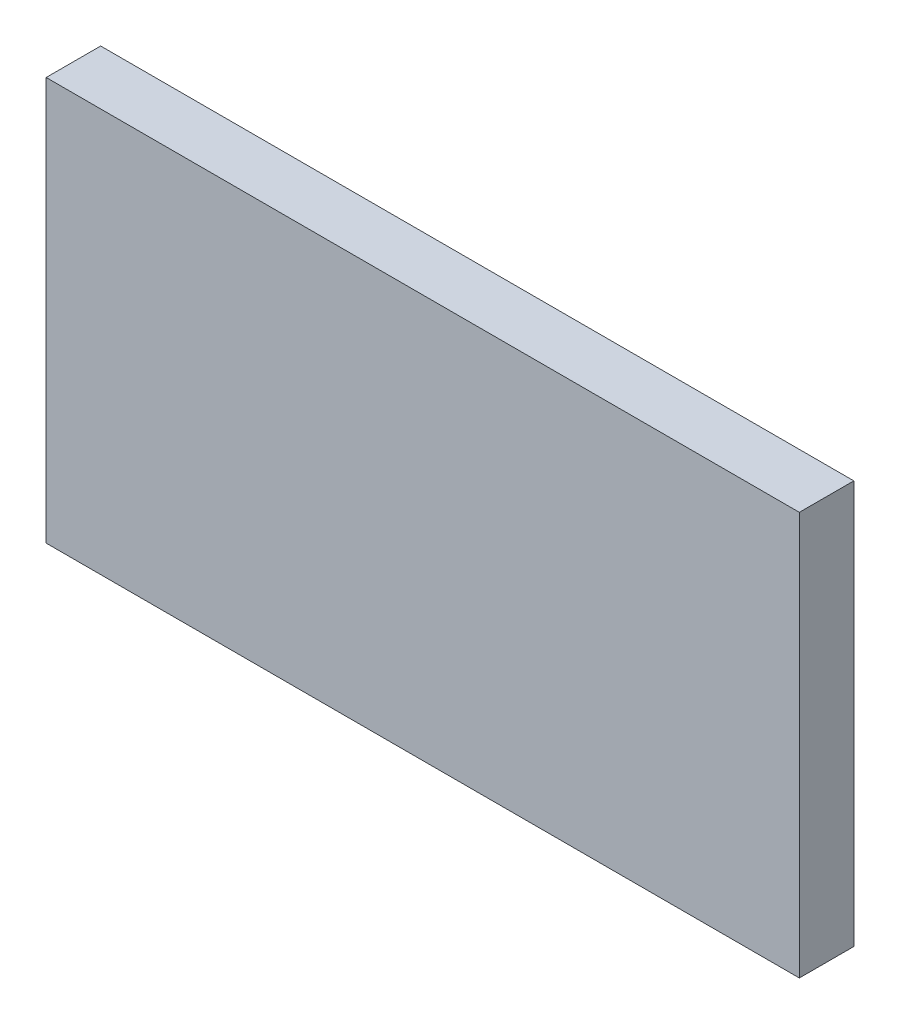
ISO-10303-21;
HEADER;
FILE_DESCRIPTION(('STEP AP214'),'2;1');
FILE_NAME('part.step','',(''),(''),'','','');
FILE_SCHEMA(('AUTOMOTIVE_DESIGN { 1 0 10303 214 1 1 1 1 }'));
ENDSEC;
DATA;
#1=APPLICATION_CONTEXT('core data for automotive mechanical design processes');
#2=APPLICATION_PROTOCOL_DEFINITION('international standard','automotive_design',2000,#1);
#3=PRODUCT_CONTEXT('',#1,'mechanical');
#4=PRODUCT('Part','Part','',(#3));
#5=PRODUCT_RELATED_PRODUCT_CATEGORY('part','',(#4));
#6=PRODUCT_DEFINITION_FORMATION('','',#4);
#7=PRODUCT_DEFINITION_CONTEXT('part definition',#1,'design');
#8=PRODUCT_DEFINITION('design','',#6,#7);
#9=PRODUCT_DEFINITION_SHAPE('','',#8);
#10=(LENGTH_UNIT() NAMED_UNIT(*) SI_UNIT(.MILLI.,.METRE.));
#11=(NAMED_UNIT(*) PLANE_ANGLE_UNIT() SI_UNIT($,.RADIAN.));
#12=(NAMED_UNIT(*) SI_UNIT($,.STERADIAN.) SOLID_ANGLE_UNIT());
#13=UNCERTAINTY_MEASURE_WITH_UNIT(LENGTH_MEASURE(1.E-05),#10,'distance_accuracy_value','');
#14=(GEOMETRIC_REPRESENTATION_CONTEXT(3) GLOBAL_UNCERTAINTY_ASSIGNED_CONTEXT((#13)) GLOBAL_UNIT_ASSIGNED_CONTEXT((#10,
#11,#12)) REPRESENTATION_CONTEXT('',''));
#15=CARTESIAN_POINT('',(0.,0.,0.));
#16=DIRECTION('',(0.,0.,1.));
#17=DIRECTION('',(1.,0.,0.));
#18=AXIS2_PLACEMENT_3D('',#15,#16,#17);
#19=CARTESIAN_POINT('',(-6.91,3.7,1.));
#20=DIRECTION('',(0.,0.,1.));
#21=DIRECTION('',(1.,0.,0.));
#22=AXIS2_PLACEMENT_3D('',#19,#20,#21);
#23=PLANE('',#22);
#24=DIRECTION('',(0.,1.,0.));
#25=VECTOR('',#24,1.);
#26=CARTESIAN_POINT('',(6.91,3.7,1.));
#27=LINE('',#26,#25);
#28=CARTESIAN_POINT('',(6.91,3.7,1.));
#29=VERTEX_POINT('',#28);
#30=CARTESIAN_POINT('',(6.91,-3.7,1.));
#31=VERTEX_POINT('',#30);
#32=EDGE_CURVE('E53',#29,#31,#27,.F.);
#33=ORIENTED_EDGE('',*,*,#32,.F.);
#34=DIRECTION('',(1.,0.,0.));
#35=VECTOR('',#34,1.);
#36=CARTESIAN_POINT('',(-6.91,3.7,1.));
#37=LINE('',#36,#35);
#38=CARTESIAN_POINT('',(-6.91,3.7,1.));
#39=VERTEX_POINT('',#38);
#40=EDGE_CURVE('E68',#39,#29,#37,.T.);
#41=ORIENTED_EDGE('',*,*,#40,.F.);
#42=DIRECTION('',(0.,1.,0.));
#43=VECTOR('',#42,1.);
#44=CARTESIAN_POINT('',(-6.91,-3.7,1.));
#45=LINE('',#44,#43);
#46=CARTESIAN_POINT('',(-6.91,-3.7,1.));
#47=VERTEX_POINT('',#46);
#48=EDGE_CURVE('E20',#47,#39,#45,.T.);
#49=ORIENTED_EDGE('',*,*,#48,.F.);
#50=DIRECTION('',(1.,0.,0.));
#51=VECTOR('',#50,1.);
#52=CARTESIAN_POINT('',(6.91,-3.7,1.));
#53=LINE('',#52,#51);
#54=EDGE_CURVE('E58',#31,#47,#53,.F.);
#55=ORIENTED_EDGE('',*,*,#54,.F.);
#56=EDGE_LOOP('',(#33,#41,#49,#55));
#57=FACE_BOUND('',#56,.T.);
#58=ADVANCED_FACE('F17',(#57),#23,.T.);
#59=CARTESIAN_POINT('',(-6.91,-3.7,0.));
#60=DIRECTION('',(-1.,0.,0.));
#61=DIRECTION('',(0.,0.,1.));
#62=AXIS2_PLACEMENT_3D('',#59,#60,#61);
#63=PLANE('',#62);
#64=DIRECTION('',(0.,0.,1.));
#65=VECTOR('',#64,1.);
#66=CARTESIAN_POINT('',(-6.91,3.7,0.));
#67=LINE('',#66,#65);
#68=CARTESIAN_POINT('',(-6.91,3.7,0.));
#69=VERTEX_POINT('',#68);
#70=EDGE_CURVE('E79',#69,#39,#67,.T.);
#71=ORIENTED_EDGE('',*,*,#70,.F.);
#72=DIRECTION('',(0.,1.,0.));
#73=VECTOR('',#72,1.);
#74=CARTESIAN_POINT('',(-6.91,3.7,0.));
#75=LINE('',#74,#73);
#76=CARTESIAN_POINT('',(-6.91,-3.7,0.));
#77=VERTEX_POINT('',#76);
#78=EDGE_CURVE('E74',#69,#77,#75,.F.);
#79=ORIENTED_EDGE('',*,*,#78,.T.);
#80=DIRECTION('',(0.,0.,-1.));
#81=VECTOR('',#80,1.);
#82=CARTESIAN_POINT('',(-6.91,-3.7,0.));
#83=LINE('',#82,#81);
#84=EDGE_CURVE('E63',#47,#77,#83,.T.);
#85=ORIENTED_EDGE('',*,*,#84,.F.);
#86=ORIENTED_EDGE('',*,*,#48,.T.);
#87=EDGE_LOOP('',(#71,#79,#85,#86));
#88=FACE_BOUND('',#87,.T.);
#89=ADVANCED_FACE('F73',(#88),#63,.T.);
#90=CARTESIAN_POINT('',(6.91,-3.7,0.));
#91=DIRECTION('',(0.,-1.,0.));
#92=DIRECTION('',(0.,0.,-1.));
#93=AXIS2_PLACEMENT_3D('',#90,#91,#92);
#94=PLANE('',#93);
#95=ORIENTED_EDGE('',*,*,#84,.T.);
#96=DIRECTION('',(1.,0.,0.));
#97=VECTOR('',#96,1.);
#98=CARTESIAN_POINT('',(-6.91,-3.7,0.));
#99=LINE('',#98,#97);
#100=CARTESIAN_POINT('',(6.91,-3.7,0.));
#101=VERTEX_POINT('',#100);
#102=EDGE_CURVE('E84',#77,#101,#99,.T.);
#103=ORIENTED_EDGE('',*,*,#102,.T.);
#104=DIRECTION('',(0.,0.,-1.));
#105=VECTOR('',#104,1.);
#106=CARTESIAN_POINT('',(6.91,-3.7,0.));
#107=LINE('',#106,#105);
#108=EDGE_CURVE('E65',#31,#101,#107,.T.);
#109=ORIENTED_EDGE('',*,*,#108,.F.);
#110=ORIENTED_EDGE('',*,*,#54,.T.);
#111=EDGE_LOOP('',(#95,#103,#109,#110));
#112=FACE_BOUND('',#111,.T.);
#113=ADVANCED_FACE('F60',(#112),#94,.T.);
#114=CARTESIAN_POINT('',(6.91,3.7,0.));
#115=DIRECTION('',(1.,0.,0.));
#116=DIRECTION('',(0.,0.,-1.));
#117=AXIS2_PLACEMENT_3D('',#114,#115,#116);
#118=PLANE('',#117);
#119=ORIENTED_EDGE('',*,*,#108,.T.);
#120=DIRECTION('',(0.,1.,0.));
#121=VECTOR('',#120,1.);
#122=CARTESIAN_POINT('',(6.91,3.7,0.));
#123=LINE('',#122,#121);
#124=CARTESIAN_POINT('',(6.91,3.7,0.));
#125=VERTEX_POINT('',#124);
#126=EDGE_CURVE('E26',#101,#125,#123,.T.);
#127=ORIENTED_EDGE('',*,*,#126,.T.);
#128=DIRECTION('',(0.,0.,1.));
#129=VECTOR('',#128,1.);
#130=CARTESIAN_POINT('',(6.91,3.7,0.));
#131=LINE('',#130,#129);
#132=EDGE_CURVE('E34',#29,#125,#131,.F.);
#133=ORIENTED_EDGE('',*,*,#132,.F.);
#134=ORIENTED_EDGE('',*,*,#32,.T.);
#135=EDGE_LOOP('',(#119,#127,#133,#134));
#136=FACE_BOUND('',#135,.T.);
#137=ADVANCED_FACE('F88',(#136),#118,.T.);
#138=CARTESIAN_POINT('',(-6.91,3.7,0.));
#139=DIRECTION('',(0.,1.,0.));
#140=DIRECTION('',(0.,0.,1.));
#141=AXIS2_PLACEMENT_3D('',#138,#139,#140);
#142=PLANE('',#141);
#143=ORIENTED_EDGE('',*,*,#132,.T.);
#144=DIRECTION('',(1.,0.,0.));
#145=VECTOR('',#144,1.);
#146=CARTESIAN_POINT('',(-6.91,3.7,0.));
#147=LINE('',#146,#145);
#148=EDGE_CURVE('E11',#125,#69,#147,.F.);
#149=ORIENTED_EDGE('',*,*,#148,.T.);
#150=ORIENTED_EDGE('',*,*,#70,.T.);
#151=ORIENTED_EDGE('',*,*,#40,.T.);
#152=EDGE_LOOP('',(#143,#149,#150,#151));
#153=FACE_BOUND('',#152,.T.);
#154=ADVANCED_FACE('F91',(#153),#142,.T.);
#155=CARTESIAN_POINT('',(-6.91,3.7,0.));
#156=DIRECTION('',(0.,0.,1.));
#157=DIRECTION('',(1.,0.,0.));
#158=AXIS2_PLACEMENT_3D('',#155,#156,#157);
#159=PLANE('',#158);
#160=ORIENTED_EDGE('',*,*,#126,.F.);
#161=ORIENTED_EDGE('',*,*,#102,.F.);
#162=ORIENTED_EDGE('',*,*,#78,.F.);
#163=ORIENTED_EDGE('',*,*,#148,.F.);
#164=EDGE_LOOP('',(#160,#161,#162,#163));
#165=FACE_BOUND('',#164,.T.);
#166=ADVANCED_FACE('F90',(#165),#159,.F.);
#167=CLOSED_SHELL('',(#58,#89,#113,#137,#154,#166));
#168=MANIFOLD_SOLID_BREP('B1',#167);
#169=ADVANCED_BREP_SHAPE_REPRESENTATION('',(#18,#168),#14);
#170=SHAPE_DEFINITION_REPRESENTATION(#9,#169);
ENDSEC;
END-ISO-10303-21;
